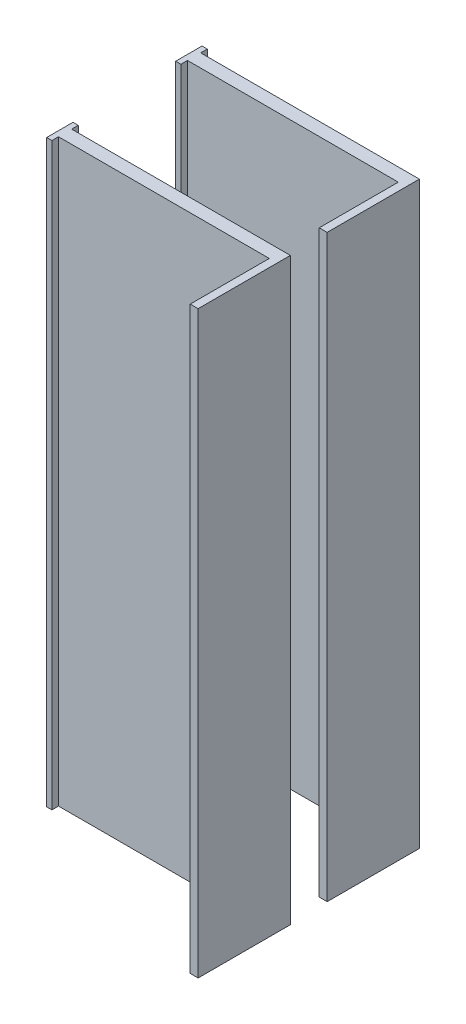
ISO-10303-21;
HEADER;
FILE_DESCRIPTION(('STEP AP214'),'2;1');
FILE_NAME('part.step','',(''),(''),'','','');
FILE_SCHEMA(('AUTOMOTIVE_DESIGN { 1 0 10303 214 1 1 1 1 }'));
ENDSEC;
DATA;
#1=APPLICATION_CONTEXT('core data for automotive mechanical design processes');
#2=APPLICATION_PROTOCOL_DEFINITION('international standard','automotive_design',2000,#1);
#3=PRODUCT_CONTEXT('',#1,'mechanical');
#4=PRODUCT('Part','Part','',(#3));
#5=PRODUCT_RELATED_PRODUCT_CATEGORY('part','',(#4));
#6=PRODUCT_DEFINITION_FORMATION('','',#4);
#7=PRODUCT_DEFINITION_CONTEXT('part definition',#1,'design');
#8=PRODUCT_DEFINITION('design','',#6,#7);
#9=PRODUCT_DEFINITION_SHAPE('','',#8);
#10=(LENGTH_UNIT() NAMED_UNIT(*) SI_UNIT(.MILLI.,.METRE.));
#11=(NAMED_UNIT(*) PLANE_ANGLE_UNIT() SI_UNIT($,.RADIAN.));
#12=(NAMED_UNIT(*) SI_UNIT($,.STERADIAN.) SOLID_ANGLE_UNIT());
#13=UNCERTAINTY_MEASURE_WITH_UNIT(LENGTH_MEASURE(1.E-05),#10,'distance_accuracy_value','');
#14=(GEOMETRIC_REPRESENTATION_CONTEXT(3) GLOBAL_UNCERTAINTY_ASSIGNED_CONTEXT((#13)) GLOBAL_UNIT_ASSIGNED_CONTEXT((#10,
#11,#12)) REPRESENTATION_CONTEXT('',''));
#15=CARTESIAN_POINT('',(0.,0.,0.));
#16=DIRECTION('',(0.,0.,1.));
#17=DIRECTION('',(1.,0.,0.));
#18=AXIS2_PLACEMENT_3D('',#15,#16,#17);
#19=CARTESIAN_POINT('',(40.5950644853225,220.,82.0545208843488));
#20=DIRECTION('',(1.,0.,0.));
#21=DIRECTION('',(0.,0.,-1.));
#22=AXIS2_PLACEMENT_3D('',#19,#20,#21);
#23=PLANE('',#22);
#24=DIRECTION('',(0.,0.,1.));
#25=VECTOR('',#24,1.);
#26=CARTESIAN_POINT('',(40.5950644853225,0.,82.0545208843488));
#27=LINE('',#26,#25);
#28=CARTESIAN_POINT('',(40.5950644853225,0.,52.0545208843483));
#29=VERTEX_POINT('',#28);
#30=CARTESIAN_POINT('',(40.5950644853225,0.,82.0545208843488));
#31=VERTEX_POINT('',#30);
#32=EDGE_CURVE('E12',#29,#31,#27,.T.);
#33=ORIENTED_EDGE('',*,*,#32,.T.);
#34=DIRECTION('',(0.,-1.,0.));
#35=VECTOR('',#34,1.);
#36=CARTESIAN_POINT('',(40.5950644853225,220.,82.0545208843488));
#37=LINE('',#36,#35);
#38=CARTESIAN_POINT('',(40.5950644853225,220.,82.0545208843488));
#39=VERTEX_POINT('',#38);
#40=EDGE_CURVE('E169',#39,#31,#37,.T.);
#41=ORIENTED_EDGE('',*,*,#40,.F.);
#42=DIRECTION('',(0.,0.,1.));
#43=VECTOR('',#42,1.);
#44=CARTESIAN_POINT('',(40.5950644853225,220.,82.0545208843488));
#45=LINE('',#44,#43);
#46=CARTESIAN_POINT('',(40.5950644853225,220.,52.0545208843483));
#47=VERTEX_POINT('',#46);
#48=EDGE_CURVE('E57',#47,#39,#45,.T.);
#49=ORIENTED_EDGE('',*,*,#48,.F.);
#50=DIRECTION('',(0.,-1.,0.));
#51=VECTOR('',#50,1.);
#52=CARTESIAN_POINT('',(40.5950644853225,220.,52.0545208843483));
#53=LINE('',#52,#51);
#54=EDGE_CURVE('E191',#47,#29,#53,.T.);
#55=ORIENTED_EDGE('',*,*,#54,.T.);
#56=EDGE_LOOP('',(#33,#41,#49,#55));
#57=FACE_BOUND('',#56,.T.);
#58=ADVANCED_FACE('F53',(#57),#23,.F.);
#59=CARTESIAN_POINT('',(43.5950644853226,220.,82.0545208843488));
#60=DIRECTION('',(0.,0.,-1.));
#61=DIRECTION('',(-1.,0.,0.));
#62=AXIS2_PLACEMENT_3D('',#59,#60,#61);
#63=PLANE('',#62);
#64=DIRECTION('',(1.,0.,0.));
#65=VECTOR('',#64,1.);
#66=CARTESIAN_POINT('',(43.5950644853226,0.,82.0545208843488));
#67=LINE('',#66,#65);
#68=CARTESIAN_POINT('',(43.5950644853226,0.,82.0545208843488));
#69=VERTEX_POINT('',#68);
#70=EDGE_CURVE('E64',#31,#69,#67,.T.);
#71=ORIENTED_EDGE('',*,*,#70,.T.);
#72=DIRECTION('',(0.,-1.,0.));
#73=VECTOR('',#72,1.);
#74=CARTESIAN_POINT('',(43.5950644853226,220.,82.0545208843488));
#75=LINE('',#74,#73);
#76=CARTESIAN_POINT('',(43.5950644853226,220.,82.0545208843488));
#77=VERTEX_POINT('',#76);
#78=EDGE_CURVE('E157',#77,#69,#75,.T.);
#79=ORIENTED_EDGE('',*,*,#78,.F.);
#80=DIRECTION('',(1.,0.,0.));
#81=VECTOR('',#80,1.);
#82=CARTESIAN_POINT('',(43.5950644853226,220.,82.0545208843488));
#83=LINE('',#82,#81);
#84=EDGE_CURVE('E106',#39,#77,#83,.T.);
#85=ORIENTED_EDGE('',*,*,#84,.F.);
#86=ORIENTED_EDGE('',*,*,#40,.T.);
#87=EDGE_LOOP('',(#71,#79,#85,#86));
#88=FACE_BOUND('',#87,.T.);
#89=ADVANCED_FACE('F241',(#88),#63,.F.);
#90=CARTESIAN_POINT('',(43.5950644853226,220.,47.0545208843484));
#91=DIRECTION('',(-1.,0.,0.));
#92=DIRECTION('',(0.,0.,1.));
#93=AXIS2_PLACEMENT_3D('',#90,#91,#92);
#94=PLANE('',#93);
#95=DIRECTION('',(0.,0.,-1.));
#96=VECTOR('',#95,1.);
#97=CARTESIAN_POINT('',(43.5950644853226,0.,47.0545208843484));
#98=LINE('',#97,#96);
#99=CARTESIAN_POINT('',(43.5950644853226,0.,47.0545208843484));
#100=VERTEX_POINT('',#99);
#101=EDGE_CURVE('E141',#69,#100,#98,.T.);
#102=ORIENTED_EDGE('',*,*,#101,.T.);
#103=DIRECTION('',(0.,-1.,0.));
#104=VECTOR('',#103,1.);
#105=CARTESIAN_POINT('',(43.5950644853226,220.,47.0545208843484));
#106=LINE('',#105,#104);
#107=CARTESIAN_POINT('',(43.5950644853226,220.,47.0545208843484));
#108=VERTEX_POINT('',#107);
#109=EDGE_CURVE('E155',#108,#100,#106,.T.);
#110=ORIENTED_EDGE('',*,*,#109,.F.);
#111=DIRECTION('',(0.,0.,-1.));
#112=VECTOR('',#111,1.);
#113=CARTESIAN_POINT('',(43.5950644853226,220.,47.0545208843484));
#114=LINE('',#113,#112);
#115=EDGE_CURVE('E232',#77,#108,#114,.T.);
#116=ORIENTED_EDGE('',*,*,#115,.F.);
#117=ORIENTED_EDGE('',*,*,#78,.T.);
#118=EDGE_LOOP('',(#102,#110,#116,#117));
#119=FACE_BOUND('',#118,.T.);
#120=ADVANCED_FACE('F153',(#119),#94,.F.);
#121=CARTESIAN_POINT('',(-39.4049355146775,220.,47.0545208843484));
#122=DIRECTION('',(0.,0.,1.));
#123=DIRECTION('',(1.,0.,0.));
#124=AXIS2_PLACEMENT_3D('',#121,#122,#123);
#125=PLANE('',#124);
#126=DIRECTION('',(-1.,0.,0.));
#127=VECTOR('',#126,1.);
#128=CARTESIAN_POINT('',(-39.4049355146775,0.,47.0545208843484));
#129=LINE('',#128,#127);
#130=CARTESIAN_POINT('',(-39.4049355146775,0.,47.0545208843484));
#131=VERTEX_POINT('',#130);
#132=EDGE_CURVE('E138',#100,#131,#129,.T.);
#133=ORIENTED_EDGE('',*,*,#132,.T.);
#134=DIRECTION('',(0.,-1.,0.));
#135=VECTOR('',#134,1.);
#136=CARTESIAN_POINT('',(-39.4049355146775,220.,47.0545208843484));
#137=LINE('',#136,#135);
#138=CARTESIAN_POINT('',(-39.4049355146775,220.,47.0545208843484));
#139=VERTEX_POINT('',#138);
#140=EDGE_CURVE('E163',#139,#131,#137,.T.);
#141=ORIENTED_EDGE('',*,*,#140,.F.);
#142=DIRECTION('',(-1.,0.,0.));
#143=VECTOR('',#142,1.);
#144=CARTESIAN_POINT('',(40.5950644853225,220.,47.0545208843484));
#145=LINE('',#144,#143);
#146=EDGE_CURVE('E161',#108,#139,#145,.T.);
#147=ORIENTED_EDGE('',*,*,#146,.F.);
#148=ORIENTED_EDGE('',*,*,#109,.T.);
#149=EDGE_LOOP('',(#133,#141,#147,#148));
#150=FACE_BOUND('',#149,.T.);
#151=ADVANCED_FACE('F160',(#150),#125,.F.);
#152=CARTESIAN_POINT('',(-39.4049355146775,220.,47.0545208843484));
#153=DIRECTION('',(-1.,0.,0.));
#154=DIRECTION('',(0.,0.,1.));
#155=AXIS2_PLACEMENT_3D('',#152,#153,#154);
#156=PLANE('',#155);
#157=DIRECTION('',(0.,0.,-1.));
#158=VECTOR('',#157,1.);
#159=CARTESIAN_POINT('',(-39.4049355146775,0.,47.0545208843484));
#160=LINE('',#159,#158);
#161=CARTESIAN_POINT('',(-39.4049355146775,0.,44.5545208843488));
#162=VERTEX_POINT('',#161);
#163=EDGE_CURVE('E143',#131,#162,#160,.T.);
#164=ORIENTED_EDGE('',*,*,#163,.T.);
#165=DIRECTION('',(0.,-1.,0.));
#166=VECTOR('',#165,1.);
#167=CARTESIAN_POINT('',(-39.4049355146775,220.,44.5545208843488));
#168=LINE('',#167,#166);
#169=CARTESIAN_POINT('',(-39.4049355146775,220.,44.5545208843488));
#170=VERTEX_POINT('',#169);
#171=EDGE_CURVE('E167',#170,#162,#168,.T.);
#172=ORIENTED_EDGE('',*,*,#171,.F.);
#173=DIRECTION('',(0.,0.,-1.));
#174=VECTOR('',#173,1.);
#175=CARTESIAN_POINT('',(-39.4049355146775,220.,47.0545208843484));
#176=LINE('',#175,#174);
#177=EDGE_CURVE('E227',#139,#170,#176,.T.);
#178=ORIENTED_EDGE('',*,*,#177,.F.);
#179=ORIENTED_EDGE('',*,*,#140,.T.);
#180=EDGE_LOOP('',(#164,#172,#178,#179));
#181=FACE_BOUND('',#180,.T.);
#182=ADVANCED_FACE('F245',(#181),#156,.F.);
#183=CARTESIAN_POINT('',(-39.4049355146775,220.,44.5545208843488));
#184=DIRECTION('',(0.,0.,1.));
#185=DIRECTION('',(1.,0.,0.));
#186=AXIS2_PLACEMENT_3D('',#183,#184,#185);
#187=PLANE('',#186);
#188=DIRECTION('',(-1.,0.,0.));
#189=VECTOR('',#188,1.);
#190=CARTESIAN_POINT('',(-39.4049355146775,0.,44.5545208843488));
#191=LINE('',#190,#189);
#192=CARTESIAN_POINT('',(-41.4049355146776,0.,44.5545208843488));
#193=VERTEX_POINT('',#192);
#194=EDGE_CURVE('E206',#162,#193,#191,.T.);
#195=ORIENTED_EDGE('',*,*,#194,.T.);
#196=DIRECTION('',(0.,-1.,0.));
#197=VECTOR('',#196,1.);
#198=CARTESIAN_POINT('',(-41.4049355146776,220.,44.5545208843488));
#199=LINE('',#198,#197);
#200=CARTESIAN_POINT('',(-41.4049355146776,220.,44.5545208843488));
#201=VERTEX_POINT('',#200);
#202=EDGE_CURVE('E176',#201,#193,#199,.T.);
#203=ORIENTED_EDGE('',*,*,#202,.F.);
#204=DIRECTION('',(-1.,0.,0.));
#205=VECTOR('',#204,1.);
#206=CARTESIAN_POINT('',(-39.4049355146775,220.,44.5545208843488));
#207=LINE('',#206,#205);
#208=EDGE_CURVE('E224',#170,#201,#207,.T.);
#209=ORIENTED_EDGE('',*,*,#208,.F.);
#210=ORIENTED_EDGE('',*,*,#171,.T.);
#211=EDGE_LOOP('',(#195,#203,#209,#210));
#212=FACE_BOUND('',#211,.T.);
#213=ADVANCED_FACE('F249',(#212),#187,.F.);
#214=CARTESIAN_POINT('',(-41.4049355146776,220.,44.5545208843488));
#215=DIRECTION('',(1.,0.,0.));
#216=DIRECTION('',(0.,0.,-1.));
#217=AXIS2_PLACEMENT_3D('',#214,#215,#216);
#218=PLANE('',#217);
#219=DIRECTION('',(0.,0.,1.));
#220=VECTOR('',#219,1.);
#221=CARTESIAN_POINT('',(-41.4049355146776,0.,44.5545208843488));
#222=LINE('',#221,#220);
#223=CARTESIAN_POINT('',(-41.4049355146776,0.,54.5545208843488));
#224=VERTEX_POINT('',#223);
#225=EDGE_CURVE('E203',#193,#224,#222,.T.);
#226=ORIENTED_EDGE('',*,*,#225,.T.);
#227=DIRECTION('',(0.,-1.,0.));
#228=VECTOR('',#227,1.);
#229=CARTESIAN_POINT('',(-41.4049355146776,220.,54.5545208843488));
#230=LINE('',#229,#228);
#231=CARTESIAN_POINT('',(-41.4049355146776,220.,54.5545208843488));
#232=VERTEX_POINT('',#231);
#233=EDGE_CURVE('E180',#232,#224,#230,.T.);
#234=ORIENTED_EDGE('',*,*,#233,.F.);
#235=DIRECTION('',(0.,0.,1.));
#236=VECTOR('',#235,1.);
#237=CARTESIAN_POINT('',(-41.4049355146776,220.,44.5545208843488));
#238=LINE('',#237,#236);
#239=EDGE_CURVE('E221',#201,#232,#238,.T.);
#240=ORIENTED_EDGE('',*,*,#239,.F.);
#241=ORIENTED_EDGE('',*,*,#202,.T.);
#242=EDGE_LOOP('',(#226,#234,#240,#241));
#243=FACE_BOUND('',#242,.T.);
#244=ADVANCED_FACE('F255',(#243),#218,.F.);
#245=CARTESIAN_POINT('',(-41.4049355146776,220.,54.5545208843488));
#246=DIRECTION('',(0.,0.,-1.));
#247=DIRECTION('',(-1.,0.,0.));
#248=AXIS2_PLACEMENT_3D('',#245,#246,#247);
#249=PLANE('',#248);
#250=DIRECTION('',(1.,0.,0.));
#251=VECTOR('',#250,1.);
#252=CARTESIAN_POINT('',(-41.4049355146776,0.,54.5545208843488));
#253=LINE('',#252,#251);
#254=CARTESIAN_POINT('',(-39.4049355146775,0.,54.5545208843488));
#255=VERTEX_POINT('',#254);
#256=EDGE_CURVE('E200',#224,#255,#253,.T.);
#257=ORIENTED_EDGE('',*,*,#256,.T.);
#258=DIRECTION('',(0.,-1.,0.));
#259=VECTOR('',#258,1.);
#260=CARTESIAN_POINT('',(-39.4049355146775,220.,54.5545208843488));
#261=LINE('',#260,#259);
#262=CARTESIAN_POINT('',(-39.4049355146775,220.,54.5545208843488));
#263=VERTEX_POINT('',#262);
#264=EDGE_CURVE('E184',#263,#255,#261,.T.);
#265=ORIENTED_EDGE('',*,*,#264,.F.);
#266=DIRECTION('',(1.,0.,0.));
#267=VECTOR('',#266,1.);
#268=CARTESIAN_POINT('',(-41.4049355146776,220.,54.5545208843488));
#269=LINE('',#268,#267);
#270=EDGE_CURVE('E218',#232,#263,#269,.T.);
#271=ORIENTED_EDGE('',*,*,#270,.F.);
#272=ORIENTED_EDGE('',*,*,#233,.T.);
#273=EDGE_LOOP('',(#257,#265,#271,#272));
#274=FACE_BOUND('',#273,.T.);
#275=ADVANCED_FACE('F259',(#274),#249,.F.);
#276=CARTESIAN_POINT('',(-39.4049355146775,220.,54.5545208843488));
#277=DIRECTION('',(-1.,0.,0.));
#278=DIRECTION('',(0.,0.,1.));
#279=AXIS2_PLACEMENT_3D('',#276,#277,#278);
#280=PLANE('',#279);
#281=DIRECTION('',(0.,0.,-1.));
#282=VECTOR('',#281,1.);
#283=CARTESIAN_POINT('',(-39.4049355146775,0.,54.5545208843488));
#284=LINE('',#283,#282);
#285=CARTESIAN_POINT('',(-39.4049355146775,0.,52.0545208843483));
#286=VERTEX_POINT('',#285);
#287=EDGE_CURVE('E197',#255,#286,#284,.T.);
#288=ORIENTED_EDGE('',*,*,#287,.T.);
#289=DIRECTION('',(0.,-1.,0.));
#290=VECTOR('',#289,1.);
#291=CARTESIAN_POINT('',(-39.4049355146775,220.,52.0545208843483));
#292=LINE('',#291,#290);
#293=CARTESIAN_POINT('',(-39.4049355146775,220.,52.0545208843483));
#294=VERTEX_POINT('',#293);
#295=EDGE_CURVE('E188',#294,#286,#292,.T.);
#296=ORIENTED_EDGE('',*,*,#295,.F.);
#297=DIRECTION('',(0.,0.,-1.));
#298=VECTOR('',#297,1.);
#299=CARTESIAN_POINT('',(-39.4049355146775,220.,54.5545208843488));
#300=LINE('',#299,#298);
#301=EDGE_CURVE('E215',#263,#294,#300,.T.);
#302=ORIENTED_EDGE('',*,*,#301,.F.);
#303=ORIENTED_EDGE('',*,*,#264,.T.);
#304=EDGE_LOOP('',(#288,#296,#302,#303));
#305=FACE_BOUND('',#304,.T.);
#306=ADVANCED_FACE('F264',(#305),#280,.F.);
#307=CARTESIAN_POINT('',(-39.4049355146775,220.,52.0545208843483));
#308=DIRECTION('',(0.,0.,-1.));
#309=DIRECTION('',(-1.,0.,0.));
#310=AXIS2_PLACEMENT_3D('',#307,#308,#309);
#311=PLANE('',#310);
#312=DIRECTION('',(1.,0.,0.));
#313=VECTOR('',#312,1.);
#314=CARTESIAN_POINT('',(-39.4049355146775,0.,52.0545208843483));
#315=LINE('',#314,#313);
#316=EDGE_CURVE('E117',#286,#29,#315,.T.);
#317=ORIENTED_EDGE('',*,*,#316,.T.);
#318=ORIENTED_EDGE('',*,*,#54,.F.);
#319=DIRECTION('',(1.,0.,0.));
#320=VECTOR('',#319,1.);
#321=CARTESIAN_POINT('',(-39.4049355146775,220.,52.0545208843483));
#322=LINE('',#321,#320);
#323=EDGE_CURVE('E194',#294,#47,#322,.T.);
#324=ORIENTED_EDGE('',*,*,#323,.F.);
#325=ORIENTED_EDGE('',*,*,#295,.T.);
#326=EDGE_LOOP('',(#317,#318,#324,#325));
#327=FACE_BOUND('',#326,.T.);
#328=ADVANCED_FACE('F265',(#327),#311,.F.);
#329=CARTESIAN_POINT('',(0.,220.,0.));
#330=DIRECTION('',(0.,-1.,0.));
#331=DIRECTION('',(0.,0.,-1.));
#332=AXIS2_PLACEMENT_3D('',#329,#330,#331);
#333=PLANE('',#332);
#334=ORIENTED_EDGE('',*,*,#48,.T.);
#335=ORIENTED_EDGE('',*,*,#84,.T.);
#336=ORIENTED_EDGE('',*,*,#115,.T.);
#337=ORIENTED_EDGE('',*,*,#146,.T.);
#338=ORIENTED_EDGE('',*,*,#177,.T.);
#339=ORIENTED_EDGE('',*,*,#208,.T.);
#340=ORIENTED_EDGE('',*,*,#239,.T.);
#341=ORIENTED_EDGE('',*,*,#270,.T.);
#342=ORIENTED_EDGE('',*,*,#301,.T.);
#343=ORIENTED_EDGE('',*,*,#323,.T.);
#344=EDGE_LOOP('',(#334,#335,#336,#337,#338,#339,#340,#341,#342,#343));
#345=FACE_BOUND('',#344,.T.);
#346=ADVANCED_FACE('F55',(#345),#333,.F.);
#347=CARTESIAN_POINT('',(0.,0.,0.));
#348=DIRECTION('',(0.,-1.,0.));
#349=DIRECTION('',(0.,0.,-1.));
#350=AXIS2_PLACEMENT_3D('',#347,#348,#349);
#351=PLANE('',#350);
#352=ORIENTED_EDGE('',*,*,#32,.F.);
#353=ORIENTED_EDGE('',*,*,#316,.F.);
#354=ORIENTED_EDGE('',*,*,#287,.F.);
#355=ORIENTED_EDGE('',*,*,#256,.F.);
#356=ORIENTED_EDGE('',*,*,#225,.F.);
#357=ORIENTED_EDGE('',*,*,#194,.F.);
#358=ORIENTED_EDGE('',*,*,#163,.F.);
#359=ORIENTED_EDGE('',*,*,#132,.F.);
#360=ORIENTED_EDGE('',*,*,#101,.F.);
#361=ORIENTED_EDGE('',*,*,#70,.F.);
#362=EDGE_LOOP('',(#352,#353,#354,#355,#356,#357,#358,#359,#360,#361));
#363=FACE_BOUND('',#362,.T.);
#364=ADVANCED_FACE('F140',(#363),#351,.T.);
#365=CLOSED_SHELL('',(#58,#89,#120,#151,#182,#213,#244,#275,#306,#328,#346,#364));
#366=MANIFOLD_SOLID_BREP('B2',#365);
#367=CARTESIAN_POINT('',(40.,220.,32.5));
#368=DIRECTION('',(1.,0.,0.));
#369=DIRECTION('',(0.,0.,-1.));
#370=AXIS2_PLACEMENT_3D('',#367,#368,#369);
#371=PLANE('',#370);
#372=DIRECTION('',(0.,0.,1.));
#373=VECTOR('',#372,1.);
#374=CARTESIAN_POINT('',(40.,0.,32.5));
#375=LINE('',#374,#373);
#376=CARTESIAN_POINT('',(40.,0.,2.5));
#377=VERTEX_POINT('',#376);
#378=CARTESIAN_POINT('',(40.,0.,32.5));
#379=VERTEX_POINT('',#378);
#380=EDGE_CURVE('E498',#377,#379,#375,.T.);
#381=ORIENTED_EDGE('',*,*,#380,.T.);
#382=DIRECTION('',(0.,-1.,0.));
#383=VECTOR('',#382,1.);
#384=CARTESIAN_POINT('',(40.,220.,32.5));
#385=LINE('',#384,#383);
#386=CARTESIAN_POINT('',(40.,220.,32.5));
#387=VERTEX_POINT('',#386);
#388=EDGE_CURVE('E51',#387,#379,#385,.T.);
#389=ORIENTED_EDGE('',*,*,#388,.F.);
#390=DIRECTION('',(0.,0.,1.));
#391=VECTOR('',#390,1.);
#392=CARTESIAN_POINT('',(40.,220.,32.5));
#393=LINE('',#392,#391);
#394=CARTESIAN_POINT('',(40.,220.,2.5));
#395=VERTEX_POINT('',#394);
#396=EDGE_CURVE('E517',#395,#387,#393,.T.);
#397=ORIENTED_EDGE('',*,*,#396,.F.);
#398=DIRECTION('',(0.,-1.,0.));
#399=VECTOR('',#398,1.);
#400=CARTESIAN_POINT('',(40.,220.,2.5));
#401=LINE('',#400,#399);
#402=EDGE_CURVE('E494',#395,#377,#401,.T.);
#403=ORIENTED_EDGE('',*,*,#402,.T.);
#404=EDGE_LOOP('',(#381,#389,#397,#403));
#405=FACE_BOUND('',#404,.T.);
#406=ADVANCED_FACE('F390',(#405),#371,.F.);
#407=CARTESIAN_POINT('',(43.0000000000001,220.,32.5));
#408=DIRECTION('',(0.,0.,-1.));
#409=DIRECTION('',(-1.,0.,0.));
#410=AXIS2_PLACEMENT_3D('',#407,#408,#409);
#411=PLANE('',#410);
#412=DIRECTION('',(1.,0.,0.));
#413=VECTOR('',#412,1.);
#414=CARTESIAN_POINT('',(43.0000000000001,0.,32.5));
#415=LINE('',#414,#413);
#416=CARTESIAN_POINT('',(43.0000000000001,0.,32.5));
#417=VERTEX_POINT('',#416);
#418=EDGE_CURVE('E501',#379,#417,#415,.T.);
#419=ORIENTED_EDGE('',*,*,#418,.T.);
#420=DIRECTION('',(0.,-1.,0.));
#421=VECTOR('',#420,1.);
#422=CARTESIAN_POINT('',(43.0000000000001,220.,32.5));
#423=LINE('',#422,#421);
#424=CARTESIAN_POINT('',(43.0000000000001,220.,32.5));
#425=VERTEX_POINT('',#424);
#426=EDGE_CURVE('E398',#425,#417,#423,.T.);
#427=ORIENTED_EDGE('',*,*,#426,.F.);
#428=DIRECTION('',(1.,0.,0.));
#429=VECTOR('',#428,1.);
#430=CARTESIAN_POINT('',(43.0000000000001,220.,32.5));
#431=LINE('',#430,#429);
#432=EDGE_CURVE('E455',#387,#425,#431,.T.);
#433=ORIENTED_EDGE('',*,*,#432,.F.);
#434=ORIENTED_EDGE('',*,*,#388,.T.);
#435=EDGE_LOOP('',(#419,#427,#433,#434));
#436=FACE_BOUND('',#435,.T.);
#437=ADVANCED_FACE('F565',(#436),#411,.F.);
#438=CARTESIAN_POINT('',(43.0000000000001,220.,-2.5));
#439=DIRECTION('',(-1.,0.,0.));
#440=DIRECTION('',(0.,0.,1.));
#441=AXIS2_PLACEMENT_3D('',#438,#439,#440);
#442=PLANE('',#441);
#443=DIRECTION('',(0.,0.,-1.));
#444=VECTOR('',#443,1.);
#445=CARTESIAN_POINT('',(43.0000000000001,0.,-2.5));
#446=LINE('',#445,#444);
#447=CARTESIAN_POINT('',(43.0000000000001,0.,-2.5));
#448=VERTEX_POINT('',#447);
#449=EDGE_CURVE('E503',#417,#448,#446,.T.);
#450=ORIENTED_EDGE('',*,*,#449,.T.);
#451=DIRECTION('',(0.,-1.,0.));
#452=VECTOR('',#451,1.);
#453=CARTESIAN_POINT('',(43.0000000000001,220.,-2.5));
#454=LINE('',#453,#452);
#455=CARTESIAN_POINT('',(43.0000000000001,220.,-2.5));
#456=VERTEX_POINT('',#455);
#457=EDGE_CURVE('E530',#456,#448,#454,.T.);
#458=ORIENTED_EDGE('',*,*,#457,.F.);
#459=DIRECTION('',(0.,0.,-1.));
#460=VECTOR('',#459,1.);
#461=CARTESIAN_POINT('',(43.0000000000001,220.,-2.5));
#462=LINE('',#461,#460);
#463=EDGE_CURVE('E538',#425,#456,#462,.T.);
#464=ORIENTED_EDGE('',*,*,#463,.F.);
#465=ORIENTED_EDGE('',*,*,#426,.T.);
#466=EDGE_LOOP('',(#450,#458,#464,#465));
#467=FACE_BOUND('',#466,.T.);
#468=ADVANCED_FACE('F536',(#467),#442,.F.);
#469=CARTESIAN_POINT('',(-40.,220.,-2.5));
#470=DIRECTION('',(0.,0.,1.));
#471=DIRECTION('',(1.,0.,0.));
#472=AXIS2_PLACEMENT_3D('',#469,#470,#471);
#473=PLANE('',#472);
#474=DIRECTION('',(-1.,0.,0.));
#475=VECTOR('',#474,1.);
#476=CARTESIAN_POINT('',(-40.,0.,-2.5));
#477=LINE('',#476,#475);
#478=CARTESIAN_POINT('',(-40.,0.,-2.5));
#479=VERTEX_POINT('',#478);
#480=EDGE_CURVE('E506',#448,#479,#477,.T.);
#481=ORIENTED_EDGE('',*,*,#480,.T.);
#482=DIRECTION('',(0.,-1.,0.));
#483=VECTOR('',#482,1.);
#484=CARTESIAN_POINT('',(-40.,220.,-2.5));
#485=LINE('',#484,#483);
#486=CARTESIAN_POINT('',(-40.,220.,-2.5));
#487=VERTEX_POINT('',#486);
#488=EDGE_CURVE('E527',#487,#479,#485,.T.);
#489=ORIENTED_EDGE('',*,*,#488,.F.);
#490=DIRECTION('',(-1.,0.,0.));
#491=VECTOR('',#490,1.);
#492=CARTESIAN_POINT('',(40.,220.,-2.5));
#493=LINE('',#492,#491);
#494=EDGE_CURVE('E555',#456,#487,#493,.T.);
#495=ORIENTED_EDGE('',*,*,#494,.F.);
#496=ORIENTED_EDGE('',*,*,#457,.T.);
#497=EDGE_LOOP('',(#481,#489,#495,#496));
#498=FACE_BOUND('',#497,.T.);
#499=ADVANCED_FACE('F546',(#498),#473,.F.);
#500=CARTESIAN_POINT('',(-40.,220.,-2.5));
#501=DIRECTION('',(-1.,0.,0.));
#502=DIRECTION('',(0.,0.,1.));
#503=AXIS2_PLACEMENT_3D('',#500,#501,#502);
#504=PLANE('',#503);
#505=DIRECTION('',(0.,0.,-1.));
#506=VECTOR('',#505,1.);
#507=CARTESIAN_POINT('',(-40.,0.,-2.5));
#508=LINE('',#507,#506);
#509=CARTESIAN_POINT('',(-40.,0.,-5.));
#510=VERTEX_POINT('',#509);
#511=EDGE_CURVE('E508',#479,#510,#508,.T.);
#512=ORIENTED_EDGE('',*,*,#511,.T.);
#513=DIRECTION('',(0.,-1.,0.));
#514=VECTOR('',#513,1.);
#515=CARTESIAN_POINT('',(-40.,220.,-5.));
#516=LINE('',#515,#514);
#517=CARTESIAN_POINT('',(-40.,220.,-5.));
#518=VERTEX_POINT('',#517);
#519=EDGE_CURVE('E524',#518,#510,#516,.T.);
#520=ORIENTED_EDGE('',*,*,#519,.F.);
#521=DIRECTION('',(0.,0.,-1.));
#522=VECTOR('',#521,1.);
#523=CARTESIAN_POINT('',(-40.,220.,-2.5));
#524=LINE('',#523,#522);
#525=EDGE_CURVE('E552',#487,#518,#524,.T.);
#526=ORIENTED_EDGE('',*,*,#525,.F.);
#527=ORIENTED_EDGE('',*,*,#488,.T.);
#528=EDGE_LOOP('',(#512,#520,#526,#527));
#529=FACE_BOUND('',#528,.T.);
#530=ADVANCED_FACE('F550',(#529),#504,.F.);
#531=CARTESIAN_POINT('',(-40.,220.,-5.));
#532=DIRECTION('',(0.,0.,1.));
#533=DIRECTION('',(1.,0.,0.));
#534=AXIS2_PLACEMENT_3D('',#531,#532,#533);
#535=PLANE('',#534);
#536=DIRECTION('',(-1.,0.,0.));
#537=VECTOR('',#536,1.);
#538=CARTESIAN_POINT('',(-40.,0.,-5.));
#539=LINE('',#538,#537);
#540=CARTESIAN_POINT('',(-41.9999999999999,0.,-5.));
#541=VERTEX_POINT('',#540);
#542=EDGE_CURVE('E510',#510,#541,#539,.T.);
#543=ORIENTED_EDGE('',*,*,#542,.T.);
#544=DIRECTION('',(0.,-1.,0.));
#545=VECTOR('',#544,1.);
#546=CARTESIAN_POINT('',(-41.9999999999999,220.,-5.));
#547=LINE('',#546,#545);
#548=CARTESIAN_POINT('',(-41.9999999999999,220.,-5.));
#549=VERTEX_POINT('',#548);
#550=EDGE_CURVE('E521',#549,#541,#547,.T.);
#551=ORIENTED_EDGE('',*,*,#550,.F.);
#552=DIRECTION('',(-1.,0.,0.));
#553=VECTOR('',#552,1.);
#554=CARTESIAN_POINT('',(-40.,220.,-5.));
#555=LINE('',#554,#553);
#556=EDGE_CURVE('E554',#518,#549,#555,.T.);
#557=ORIENTED_EDGE('',*,*,#556,.F.);
#558=ORIENTED_EDGE('',*,*,#519,.T.);
#559=EDGE_LOOP('',(#543,#551,#557,#558));
#560=FACE_BOUND('',#559,.T.);
#561=ADVANCED_FACE('F577',(#560),#535,.F.);
#562=CARTESIAN_POINT('',(-41.9999999999999,220.,-5.));
#563=DIRECTION('',(1.,0.,0.));
#564=DIRECTION('',(0.,0.,-1.));
#565=AXIS2_PLACEMENT_3D('',#562,#563,#564);
#566=PLANE('',#565);
#567=DIRECTION('',(0.,0.,1.));
#568=VECTOR('',#567,1.);
#569=CARTESIAN_POINT('',(-41.9999999999999,0.,-5.));
#570=LINE('',#569,#568);
#571=CARTESIAN_POINT('',(-41.9999999999999,0.,5.));
#572=VERTEX_POINT('',#571);
#573=EDGE_CURVE('E512',#541,#572,#570,.T.);
#574=ORIENTED_EDGE('',*,*,#573,.T.);
#575=DIRECTION('',(0.,-1.,0.));
#576=VECTOR('',#575,1.);
#577=CARTESIAN_POINT('',(-41.9999999999999,220.,5.));
#578=LINE('',#577,#576);
#579=CARTESIAN_POINT('',(-41.9999999999999,220.,5.));
#580=VERTEX_POINT('',#579);
#581=EDGE_CURVE('E489',#580,#572,#578,.T.);
#582=ORIENTED_EDGE('',*,*,#581,.F.);
#583=DIRECTION('',(0.,0.,1.));
#584=VECTOR('',#583,1.);
#585=CARTESIAN_POINT('',(-41.9999999999999,220.,-5.));
#586=LINE('',#585,#584);
#587=EDGE_CURVE('E480',#549,#580,#586,.T.);
#588=ORIENTED_EDGE('',*,*,#587,.F.);
#589=ORIENTED_EDGE('',*,*,#550,.T.);
#590=EDGE_LOOP('',(#574,#582,#588,#589));
#591=FACE_BOUND('',#590,.T.);
#592=ADVANCED_FACE('F580',(#591),#566,.F.);
#593=CARTESIAN_POINT('',(-41.9999999999999,220.,5.));
#594=DIRECTION('',(0.,0.,-1.));
#595=DIRECTION('',(-1.,0.,0.));
#596=AXIS2_PLACEMENT_3D('',#593,#594,#595);
#597=PLANE('',#596);
#598=DIRECTION('',(1.,0.,0.));
#599=VECTOR('',#598,1.);
#600=CARTESIAN_POINT('',(-41.9999999999999,0.,5.));
#601=LINE('',#600,#599);
#602=CARTESIAN_POINT('',(-40.,0.,5.));
#603=VERTEX_POINT('',#602);
#604=EDGE_CURVE('E488',#572,#603,#601,.T.);
#605=ORIENTED_EDGE('',*,*,#604,.T.);
#606=DIRECTION('',(0.,-1.,0.));
#607=VECTOR('',#606,1.);
#608=CARTESIAN_POINT('',(-40.,220.,5.));
#609=LINE('',#608,#607);
#610=CARTESIAN_POINT('',(-40.,220.,5.));
#611=VERTEX_POINT('',#610);
#612=EDGE_CURVE('E485',#611,#603,#609,.T.);
#613=ORIENTED_EDGE('',*,*,#612,.F.);
#614=DIRECTION('',(1.,0.,0.));
#615=VECTOR('',#614,1.);
#616=CARTESIAN_POINT('',(-41.9999999999999,220.,5.));
#617=LINE('',#616,#615);
#618=EDGE_CURVE('E474',#580,#611,#617,.T.);
#619=ORIENTED_EDGE('',*,*,#618,.F.);
#620=ORIENTED_EDGE('',*,*,#581,.T.);
#621=EDGE_LOOP('',(#605,#613,#619,#620));
#622=FACE_BOUND('',#621,.T.);
#623=ADVANCED_FACE('F486',(#622),#597,.F.);
#624=CARTESIAN_POINT('',(-40.,220.,5.));
#625=DIRECTION('',(-1.,0.,0.));
#626=DIRECTION('',(0.,0.,1.));
#627=AXIS2_PLACEMENT_3D('',#624,#625,#626);
#628=PLANE('',#627);
#629=DIRECTION('',(0.,0.,-1.));
#630=VECTOR('',#629,1.);
#631=CARTESIAN_POINT('',(-40.,0.,5.));
#632=LINE('',#631,#630);
#633=CARTESIAN_POINT('',(-40.,0.,2.5));
#634=VERTEX_POINT('',#633);
#635=EDGE_CURVE('E441',#603,#634,#632,.T.);
#636=ORIENTED_EDGE('',*,*,#635,.T.);
#637=DIRECTION('',(0.,-1.,0.));
#638=VECTOR('',#637,1.);
#639=CARTESIAN_POINT('',(-40.,220.,2.5));
#640=LINE('',#639,#638);
#641=CARTESIAN_POINT('',(-40.,220.,2.5));
#642=VERTEX_POINT('',#641);
#643=EDGE_CURVE('E490',#642,#634,#640,.T.);
#644=ORIENTED_EDGE('',*,*,#643,.F.);
#645=DIRECTION('',(0.,0.,-1.));
#646=VECTOR('',#645,1.);
#647=CARTESIAN_POINT('',(-40.,220.,5.));
#648=LINE('',#647,#646);
#649=EDGE_CURVE('E478',#611,#642,#648,.T.);
#650=ORIENTED_EDGE('',*,*,#649,.F.);
#651=ORIENTED_EDGE('',*,*,#612,.T.);
#652=EDGE_LOOP('',(#636,#644,#650,#651));
#653=FACE_BOUND('',#652,.T.);
#654=ADVANCED_FACE('F492',(#653),#628,.F.);
#655=CARTESIAN_POINT('',(-40.,220.,2.5));
#656=DIRECTION('',(0.,0.,-1.));
#657=DIRECTION('',(-1.,0.,0.));
#658=AXIS2_PLACEMENT_3D('',#655,#656,#657);
#659=PLANE('',#658);
#660=DIRECTION('',(1.,0.,0.));
#661=VECTOR('',#660,1.);
#662=CARTESIAN_POINT('',(-40.,0.,2.5));
#663=LINE('',#662,#661);
#664=EDGE_CURVE('E447',#634,#377,#663,.T.);
#665=ORIENTED_EDGE('',*,*,#664,.T.);
#666=ORIENTED_EDGE('',*,*,#402,.F.);
#667=DIRECTION('',(1.,0.,0.));
#668=VECTOR('',#667,1.);
#669=CARTESIAN_POINT('',(-40.,220.,2.5));
#670=LINE('',#669,#668);
#671=EDGE_CURVE('E406',#642,#395,#670,.T.);
#672=ORIENTED_EDGE('',*,*,#671,.F.);
#673=ORIENTED_EDGE('',*,*,#643,.T.);
#674=EDGE_LOOP('',(#665,#666,#672,#673));
#675=FACE_BOUND('',#674,.T.);
#676=ADVANCED_FACE('F589',(#675),#659,.F.);
#677=CARTESIAN_POINT('',(0.,220.,0.));
#678=DIRECTION('',(0.,-1.,0.));
#679=DIRECTION('',(0.,0.,-1.));
#680=AXIS2_PLACEMENT_3D('',#677,#678,#679);
#681=PLANE('',#680);
#682=ORIENTED_EDGE('',*,*,#396,.T.);
#683=ORIENTED_EDGE('',*,*,#432,.T.);
#684=ORIENTED_EDGE('',*,*,#463,.T.);
#685=ORIENTED_EDGE('',*,*,#494,.T.);
#686=ORIENTED_EDGE('',*,*,#525,.T.);
#687=ORIENTED_EDGE('',*,*,#556,.T.);
#688=ORIENTED_EDGE('',*,*,#587,.T.);
#689=ORIENTED_EDGE('',*,*,#618,.T.);
#690=ORIENTED_EDGE('',*,*,#649,.T.);
#691=ORIENTED_EDGE('',*,*,#671,.T.);
#692=EDGE_LOOP('',(#682,#683,#684,#685,#686,#687,#688,#689,#690,#691));
#693=FACE_BOUND('',#692,.T.);
#694=ADVANCED_FACE('F476',(#693),#681,.F.);
#695=CARTESIAN_POINT('',(0.,0.,0.));
#696=DIRECTION('',(0.,-1.,0.));
#697=DIRECTION('',(0.,0.,-1.));
#698=AXIS2_PLACEMENT_3D('',#695,#696,#697);
#699=PLANE('',#698);
#700=ORIENTED_EDGE('',*,*,#380,.F.);
#701=ORIENTED_EDGE('',*,*,#664,.F.);
#702=ORIENTED_EDGE('',*,*,#635,.F.);
#703=ORIENTED_EDGE('',*,*,#604,.F.);
#704=ORIENTED_EDGE('',*,*,#573,.F.);
#705=ORIENTED_EDGE('',*,*,#542,.F.);
#706=ORIENTED_EDGE('',*,*,#511,.F.);
#707=ORIENTED_EDGE('',*,*,#480,.F.);
#708=ORIENTED_EDGE('',*,*,#449,.F.);
#709=ORIENTED_EDGE('',*,*,#418,.F.);
#710=EDGE_LOOP('',(#700,#701,#702,#703,#704,#705,#706,#707,#708,#709));
#711=FACE_BOUND('',#710,.T.);
#712=ADVANCED_FACE('F541',(#711),#699,.T.);
#713=CLOSED_SHELL('',(#406,#437,#468,#499,#530,#561,#592,#623,#654,#676,#694,#712));
#714=MANIFOLD_SOLID_BREP('B6',#713);
#715=ADVANCED_BREP_SHAPE_REPRESENTATION('',(#18,#366,#714),#14);
#716=SHAPE_DEFINITION_REPRESENTATION(#9,#715);
ENDSEC;
END-ISO-10303-21;
